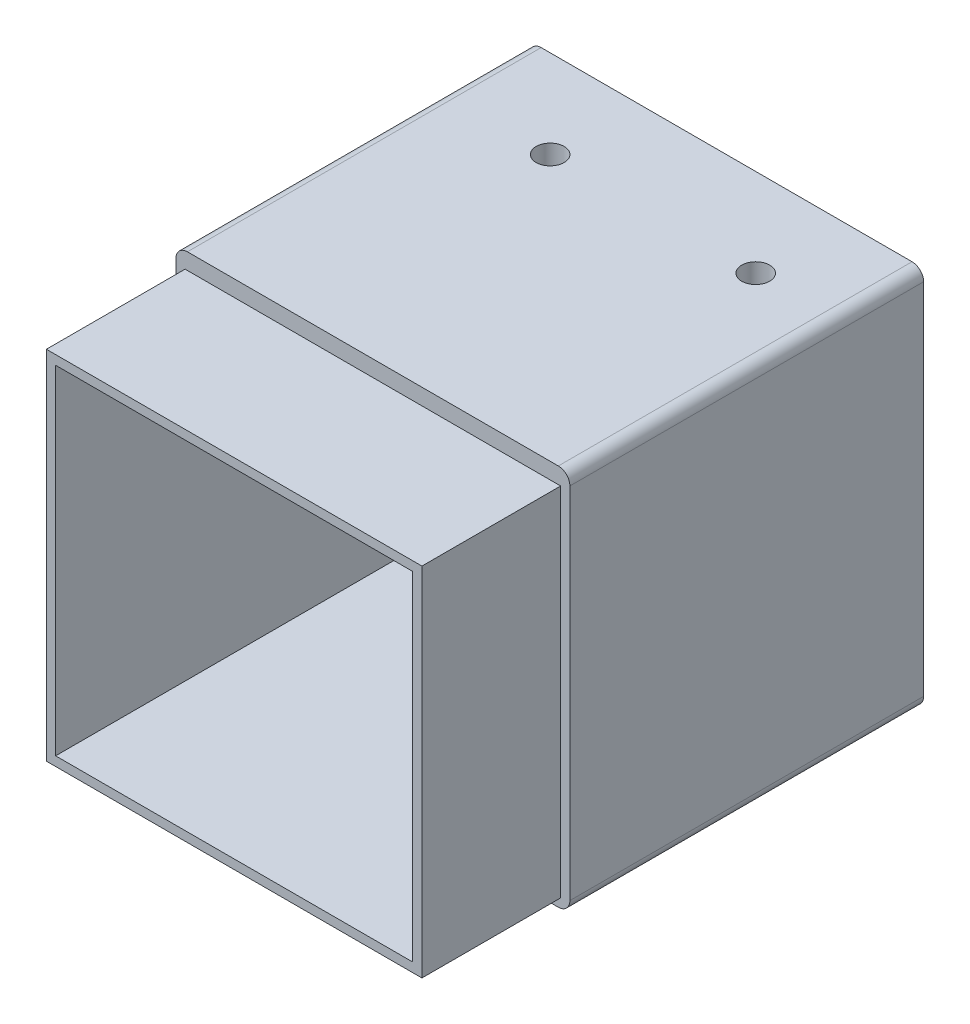
ISO-10303-21;
HEADER;
FILE_DESCRIPTION(('STEP AP214'),'2;1');
FILE_NAME('part.step','',(''),(''),'','','');
FILE_SCHEMA(('AUTOMOTIVE_DESIGN { 1 0 10303 214 1 1 1 1 }'));
ENDSEC;
DATA;
#1=APPLICATION_CONTEXT('core data for automotive mechanical design processes');
#2=APPLICATION_PROTOCOL_DEFINITION('international standard','automotive_design',2000,#1);
#3=PRODUCT_CONTEXT('',#1,'mechanical');
#4=PRODUCT('Part','Part','',(#3));
#5=PRODUCT_RELATED_PRODUCT_CATEGORY('part','',(#4));
#6=PRODUCT_DEFINITION_FORMATION('','',#4);
#7=PRODUCT_DEFINITION_CONTEXT('part definition',#1,'design');
#8=PRODUCT_DEFINITION('design','',#6,#7);
#9=PRODUCT_DEFINITION_SHAPE('','',#8);
#10=(LENGTH_UNIT() NAMED_UNIT(*) SI_UNIT(.MILLI.,.METRE.));
#11=(NAMED_UNIT(*) PLANE_ANGLE_UNIT() SI_UNIT($,.RADIAN.));
#12=(NAMED_UNIT(*) SI_UNIT($,.STERADIAN.) SOLID_ANGLE_UNIT());
#13=UNCERTAINTY_MEASURE_WITH_UNIT(LENGTH_MEASURE(1.E-05),#10,'distance_accuracy_value','');
#14=(GEOMETRIC_REPRESENTATION_CONTEXT(3) GLOBAL_UNCERTAINTY_ASSIGNED_CONTEXT((#13)) GLOBAL_UNIT_ASSIGNED_CONTEXT((#10,
#11,#12)) REPRESENTATION_CONTEXT('',''));
#15=CARTESIAN_POINT('',(0.,0.,0.));
#16=DIRECTION('',(0.,0.,1.));
#17=DIRECTION('',(1.,0.,0.));
#18=AXIS2_PLACEMENT_3D('',#15,#16,#17);
#19=CARTESIAN_POINT('',(-42.608,-40.576,182.776));
#20=DIRECTION('',(0.,1.,0.));
#21=DIRECTION('',(-1.,0.,0.));
#22=AXIS2_PLACEMENT_3D('',#19,#20,#21);
#23=PLANE('',#22);
#24=DIRECTION('',(-1.,0.,0.));
#25=VECTOR('',#24,1.);
#26=CARTESIAN_POINT('',(-42.608,-40.576,80.));
#27=LINE('',#26,#25);
#28=CARTESIAN_POINT('',(40.108,-40.576,80.));
#29=VERTEX_POINT('',#28);
#30=CARTESIAN_POINT('',(-40.108,-40.576,80.));
#31=VERTEX_POINT('',#30);
#32=EDGE_CURVE('E233',#29,#31,#27,.T.);
#33=ORIENTED_EDGE('',*,*,#32,.T.);
#34=DIRECTION('',(0.,0.,-1.));
#35=VECTOR('',#34,1.);
#36=CARTESIAN_POINT('',(-40.108,-40.576,182.776));
#37=LINE('',#36,#35);
#38=CARTESIAN_POINT('',(-40.108,-40.576,3.5));
#39=VERTEX_POINT('',#38);
#40=EDGE_CURVE('E11',#31,#39,#37,.T.);
#41=ORIENTED_EDGE('',*,*,#40,.T.);
#42=DIRECTION('',(-1.,0.,0.));
#43=VECTOR('',#42,1.);
#44=CARTESIAN_POINT('',(42.608,-40.576,3.5));
#45=LINE('',#44,#43);
#46=CARTESIAN_POINT('',(40.108,-40.576,3.5));
#47=VERTEX_POINT('',#46);
#48=EDGE_CURVE('E272',#47,#39,#45,.T.);
#49=ORIENTED_EDGE('',*,*,#48,.F.);
#50=DIRECTION('',(0.,0.,-1.));
#51=VECTOR('',#50,1.);
#52=CARTESIAN_POINT('',(40.108,-40.576,182.776));
#53=LINE('',#52,#51);
#54=EDGE_CURVE('E49',#47,#29,#53,.F.);
#55=ORIENTED_EDGE('',*,*,#54,.T.);
#56=EDGE_LOOP('',(#33,#41,#49,#55));
#57=FACE_BOUND('',#56,.T.);
#58=ADVANCED_FACE('F41',(#57),#23,.F.);
#59=CARTESIAN_POINT('',(42.608,40.576,182.776));
#60=DIRECTION('',(-1.,0.,0.));
#61=DIRECTION('',(0.,-1.,0.));
#62=AXIS2_PLACEMENT_3D('',#59,#60,#61);
#63=PLANE('',#62);
#64=DIRECTION('',(0.,-1.,0.));
#65=VECTOR('',#64,1.);
#66=CARTESIAN_POINT('',(42.608,40.576,3.5));
#67=LINE('',#66,#65);
#68=CARTESIAN_POINT('',(42.608,39.576,3.5));
#69=VERTEX_POINT('',#68);
#70=CARTESIAN_POINT('',(42.608,-38.076,3.5));
#71=VERTEX_POINT('',#70);
#72=EDGE_CURVE('E284',#69,#71,#67,.T.);
#73=ORIENTED_EDGE('',*,*,#72,.F.);
#74=DIRECTION('',(0.,0.,-1.));
#75=VECTOR('',#74,1.);
#76=CARTESIAN_POINT('',(42.608,39.576,80.));
#77=LINE('',#76,#75);
#78=CARTESIAN_POINT('',(42.608,39.576,80.));
#79=VERTEX_POINT('',#78);
#80=EDGE_CURVE('E255',#69,#79,#77,.F.);
#81=ORIENTED_EDGE('',*,*,#80,.T.);
#82=DIRECTION('',(0.,-1.,0.));
#83=VECTOR('',#82,1.);
#84=CARTESIAN_POINT('',(42.608,40.576,80.));
#85=LINE('',#84,#83);
#86=CARTESIAN_POINT('',(42.608,-38.076,80.));
#87=VERTEX_POINT('',#86);
#88=EDGE_CURVE('E227',#79,#87,#85,.T.);
#89=ORIENTED_EDGE('',*,*,#88,.T.);
#90=DIRECTION('',(0.,0.,-1.));
#91=VECTOR('',#90,1.);
#92=CARTESIAN_POINT('',(42.608,-38.076,182.776));
#93=LINE('',#92,#91);
#94=EDGE_CURVE('E252',#87,#71,#93,.T.);
#95=ORIENTED_EDGE('',*,*,#94,.T.);
#96=EDGE_LOOP('',(#73,#81,#89,#95));
#97=FACE_BOUND('',#96,.T.);
#98=ADVANCED_FACE('F283',(#97),#63,.F.);
#99=CARTESIAN_POINT('',(-42.608,40.576,182.776));
#100=DIRECTION('',(1.,0.,0.));
#101=DIRECTION('',(0.,1.,0.));
#102=AXIS2_PLACEMENT_3D('',#99,#100,#101);
#103=PLANE('',#102);
#104=DIRECTION('',(0.,1.,0.));
#105=VECTOR('',#104,1.);
#106=CARTESIAN_POINT('',(-42.608,40.576,80.));
#107=LINE('',#106,#105);
#108=CARTESIAN_POINT('',(-42.608,-38.076,80.));
#109=VERTEX_POINT('',#108);
#110=CARTESIAN_POINT('',(-42.608,39.576,80.));
#111=VERTEX_POINT('',#110);
#112=EDGE_CURVE('E236',#109,#111,#107,.T.);
#113=ORIENTED_EDGE('',*,*,#112,.T.);
#114=DIRECTION('',(0.,0.,1.));
#115=VECTOR('',#114,1.);
#116=CARTESIAN_POINT('',(-42.608,39.576,3.5));
#117=LINE('',#116,#115);
#118=CARTESIAN_POINT('',(-42.608,39.576,3.5));
#119=VERTEX_POINT('',#118);
#120=EDGE_CURVE('E265',#111,#119,#117,.F.);
#121=ORIENTED_EDGE('',*,*,#120,.T.);
#122=DIRECTION('',(0.,1.,0.));
#123=VECTOR('',#122,1.);
#124=CARTESIAN_POINT('',(-42.608,-40.576,3.5));
#125=LINE('',#124,#123);
#126=CARTESIAN_POINT('',(-42.608,-38.076,3.5));
#127=VERTEX_POINT('',#126);
#128=EDGE_CURVE('E291',#127,#119,#125,.T.);
#129=ORIENTED_EDGE('',*,*,#128,.F.);
#130=DIRECTION('',(0.,0.,-1.));
#131=VECTOR('',#130,1.);
#132=CARTESIAN_POINT('',(-42.608,-38.076,182.776));
#133=LINE('',#132,#131);
#134=EDGE_CURVE('E63',#127,#109,#133,.F.);
#135=ORIENTED_EDGE('',*,*,#134,.T.);
#136=EDGE_LOOP('',(#113,#121,#129,#135));
#137=FACE_BOUND('',#136,.T.);
#138=ADVANCED_FACE('F319',(#137),#103,.F.);
#139=CARTESIAN_POINT('',(0.,0.,80.));
#140=DIRECTION('',(0.,0.,-1.));
#141=DIRECTION('',(-1.,0.,0.));
#142=AXIS2_PLACEMENT_3D('',#139,#140,#141);
#143=PLANE('',#142);
#144=ORIENTED_EDGE('',*,*,#88,.F.);
#145=CARTESIAN_POINT('',(40.108,39.576,80.));
#146=DIRECTION('',(0.,0.,-1.));
#147=DIRECTION('',(-1.,0.,0.));
#148=AXIS2_PLACEMENT_3D('',#145,#146,#147);
#149=CIRCLE('',#148,2.5);
#150=CARTESIAN_POINT('',(40.108,42.076,80.));
#151=VERTEX_POINT('',#150);
#152=EDGE_CURVE('E262',#79,#151,#149,.F.);
#153=ORIENTED_EDGE('',*,*,#152,.T.);
#154=DIRECTION('',(1.,0.,0.));
#155=VECTOR('',#154,1.);
#156=CARTESIAN_POINT('',(-42.608,42.076,80.));
#157=LINE('',#156,#155);
#158=CARTESIAN_POINT('',(-40.108,42.076,80.));
#159=VERTEX_POINT('',#158);
#160=EDGE_CURVE('E289',#159,#151,#157,.T.);
#161=ORIENTED_EDGE('',*,*,#160,.F.);
#162=CARTESIAN_POINT('',(-40.108,39.576,80.));
#163=DIRECTION('',(0.,0.,-1.));
#164=DIRECTION('',(-1.,0.,0.));
#165=AXIS2_PLACEMENT_3D('',#162,#163,#164);
#166=CIRCLE('',#165,2.5);
#167=EDGE_CURVE('E56',#159,#111,#166,.F.);
#168=ORIENTED_EDGE('',*,*,#167,.T.);
#169=ORIENTED_EDGE('',*,*,#112,.F.);
#170=CARTESIAN_POINT('',(-40.108,-38.076,80.));
#171=DIRECTION('',(0.,0.,-1.));
#172=DIRECTION('',(-1.,0.,0.));
#173=AXIS2_PLACEMENT_3D('',#170,#171,#172);
#174=CIRCLE('',#173,2.5);
#175=EDGE_CURVE('E259',#109,#31,#174,.F.);
#176=ORIENTED_EDGE('',*,*,#175,.T.);
#177=ORIENTED_EDGE('',*,*,#32,.F.);
#178=CARTESIAN_POINT('',(40.108,-38.076,80.));
#179=DIRECTION('',(0.,0.,-1.));
#180=DIRECTION('',(-1.,0.,0.));
#181=AXIS2_PLACEMENT_3D('',#178,#179,#180);
#182=CIRCLE('',#181,2.5);
#183=EDGE_CURVE('E257',#29,#87,#182,.F.);
#184=ORIENTED_EDGE('',*,*,#183,.T.);
#185=EDGE_LOOP('',(#144,#153,#161,#168,#169,#176,#177,#184));
#186=FACE_BOUND('',#185,.T.);
#187=DIRECTION('',(1.,0.,0.));
#188=VECTOR('',#187,1.);
#189=CARTESIAN_POINT('',(-40.608,-38.576,80.));
#190=LINE('',#189,#188);
#191=CARTESIAN_POINT('',(-40.608,-38.576,80.));
#192=VERTEX_POINT('',#191);
#193=CARTESIAN_POINT('',(40.608,-38.576,80.));
#194=VERTEX_POINT('',#193);
#195=EDGE_CURVE('E192',#192,#194,#190,.T.);
#196=ORIENTED_EDGE('',*,*,#195,.F.);
#197=DIRECTION('',(0.,-1.,0.));
#198=VECTOR('',#197,1.);
#199=CARTESIAN_POINT('',(-40.608,38.576,80.));
#200=LINE('',#199,#198);
#201=CARTESIAN_POINT('',(-40.608,38.576,80.));
#202=VERTEX_POINT('',#201);
#203=EDGE_CURVE('E197',#202,#192,#200,.T.);
#204=ORIENTED_EDGE('',*,*,#203,.F.);
#205=DIRECTION('',(-1.,0.,0.));
#206=VECTOR('',#205,1.);
#207=CARTESIAN_POINT('',(40.608,38.576,80.));
#208=LINE('',#207,#206);
#209=CARTESIAN_POINT('',(40.608,38.576,80.));
#210=VERTEX_POINT('',#209);
#211=EDGE_CURVE('E209',#210,#202,#208,.T.);
#212=ORIENTED_EDGE('',*,*,#211,.F.);
#213=DIRECTION('',(0.,1.,0.));
#214=VECTOR('',#213,1.);
#215=CARTESIAN_POINT('',(40.608,-38.576,80.));
#216=LINE('',#215,#214);
#217=EDGE_CURVE('E206',#194,#210,#216,.T.);
#218=ORIENTED_EDGE('',*,*,#217,.F.);
#219=EDGE_LOOP('',(#196,#204,#212,#218));
#220=FACE_BOUND('',#219,.T.);
#221=ADVANCED_FACE('F276',(#186,#220),#143,.F.);
#222=CARTESIAN_POINT('',(0.,0.,110.));
#223=DIRECTION('',(0.,0.,1.));
#224=DIRECTION('',(1.,0.,0.));
#225=AXIS2_PLACEMENT_3D('',#222,#223,#224);
#226=PLANE('',#225);
#227=DIRECTION('',(1.,0.,0.));
#228=VECTOR('',#227,1.);
#229=CARTESIAN_POINT('',(-40.608,-38.576,110.));
#230=LINE('',#229,#228);
#231=CARTESIAN_POINT('',(-40.608,-38.576,110.));
#232=VERTEX_POINT('',#231);
#233=CARTESIAN_POINT('',(40.608,-38.576,110.));
#234=VERTEX_POINT('',#233);
#235=EDGE_CURVE('E193',#232,#234,#230,.T.);
#236=ORIENTED_EDGE('',*,*,#235,.T.);
#237=DIRECTION('',(0.,1.,0.));
#238=VECTOR('',#237,1.);
#239=CARTESIAN_POINT('',(40.608,-38.576,110.));
#240=LINE('',#239,#238);
#241=CARTESIAN_POINT('',(40.608,38.576,110.));
#242=VERTEX_POINT('',#241);
#243=EDGE_CURVE('E196',#234,#242,#240,.T.);
#244=ORIENTED_EDGE('',*,*,#243,.T.);
#245=DIRECTION('',(-1.,0.,0.));
#246=VECTOR('',#245,1.);
#247=CARTESIAN_POINT('',(40.608,38.576,110.));
#248=LINE('',#247,#246);
#249=CARTESIAN_POINT('',(-40.608,38.576,110.));
#250=VERTEX_POINT('',#249);
#251=EDGE_CURVE('E199',#242,#250,#248,.T.);
#252=ORIENTED_EDGE('',*,*,#251,.T.);
#253=DIRECTION('',(0.,-1.,0.));
#254=VECTOR('',#253,1.);
#255=CARTESIAN_POINT('',(-40.608,38.576,110.));
#256=LINE('',#255,#254);
#257=EDGE_CURVE('E201',#250,#232,#256,.T.);
#258=ORIENTED_EDGE('',*,*,#257,.T.);
#259=EDGE_LOOP('',(#236,#244,#252,#258));
#260=FACE_BOUND('',#259,.T.);
#261=DIRECTION('',(0.,-1.,0.));
#262=VECTOR('',#261,1.);
#263=CARTESIAN_POINT('',(-38.608,36.576,110.));
#264=LINE('',#263,#262);
#265=CARTESIAN_POINT('',(-38.608,36.576,110.));
#266=VERTEX_POINT('',#265);
#267=CARTESIAN_POINT('',(-38.608,-36.576,110.));
#268=VERTEX_POINT('',#267);
#269=EDGE_CURVE('E186',#266,#268,#264,.T.);
#270=ORIENTED_EDGE('',*,*,#269,.F.);
#271=DIRECTION('',(-1.,0.,0.));
#272=VECTOR('',#271,1.);
#273=CARTESIAN_POINT('',(38.608,36.576,110.));
#274=LINE('',#273,#272);
#275=CARTESIAN_POINT('',(38.608,36.576,110.));
#276=VERTEX_POINT('',#275);
#277=EDGE_CURVE('E174',#276,#266,#274,.T.);
#278=ORIENTED_EDGE('',*,*,#277,.F.);
#279=DIRECTION('',(0.,1.,0.));
#280=VECTOR('',#279,1.);
#281=CARTESIAN_POINT('',(38.608,-36.576,110.));
#282=LINE('',#281,#280);
#283=CARTESIAN_POINT('',(38.608,-36.576,110.));
#284=VERTEX_POINT('',#283);
#285=EDGE_CURVE('E190',#284,#276,#282,.T.);
#286=ORIENTED_EDGE('',*,*,#285,.F.);
#287=DIRECTION('',(1.,0.,0.));
#288=VECTOR('',#287,1.);
#289=CARTESIAN_POINT('',(-38.608,-36.576,110.));
#290=LINE('',#289,#288);
#291=EDGE_CURVE('E161',#268,#284,#290,.T.);
#292=ORIENTED_EDGE('',*,*,#291,.F.);
#293=EDGE_LOOP('',(#270,#278,#286,#292));
#294=FACE_BOUND('',#293,.T.);
#295=ADVANCED_FACE('F306',(#260,#294),#226,.T.);
#296=CARTESIAN_POINT('',(-40.608,-38.576,110.));
#297=DIRECTION('',(0.,1.,0.));
#298=DIRECTION('',(-1.,0.,0.));
#299=AXIS2_PLACEMENT_3D('',#296,#297,#298);
#300=PLANE('',#299);
#301=ORIENTED_EDGE('',*,*,#195,.T.);
#302=DIRECTION('',(0.,0.,-1.));
#303=VECTOR('',#302,1.);
#304=CARTESIAN_POINT('',(40.608,-38.576,110.));
#305=LINE('',#304,#303);
#306=EDGE_CURVE('E222',#234,#194,#305,.T.);
#307=ORIENTED_EDGE('',*,*,#306,.F.);
#308=ORIENTED_EDGE('',*,*,#235,.F.);
#309=DIRECTION('',(0.,0.,-1.));
#310=VECTOR('',#309,1.);
#311=CARTESIAN_POINT('',(-40.608,-38.576,110.));
#312=LINE('',#311,#310);
#313=EDGE_CURVE('E203',#232,#192,#312,.T.);
#314=ORIENTED_EDGE('',*,*,#313,.T.);
#315=EDGE_LOOP('',(#301,#307,#308,#314));
#316=FACE_BOUND('',#315,.T.);
#317=ADVANCED_FACE('F308',(#316),#300,.F.);
#318=CARTESIAN_POINT('',(40.608,-38.576,110.));
#319=DIRECTION('',(-1.,0.,0.));
#320=DIRECTION('',(0.,-1.,0.));
#321=AXIS2_PLACEMENT_3D('',#318,#319,#320);
#322=PLANE('',#321);
#323=ORIENTED_EDGE('',*,*,#217,.T.);
#324=DIRECTION('',(0.,0.,-1.));
#325=VECTOR('',#324,1.);
#326=CARTESIAN_POINT('',(40.608,38.576,110.));
#327=LINE('',#326,#325);
#328=EDGE_CURVE('E219',#242,#210,#327,.T.);
#329=ORIENTED_EDGE('',*,*,#328,.F.);
#330=ORIENTED_EDGE('',*,*,#243,.F.);
#331=ORIENTED_EDGE('',*,*,#306,.T.);
#332=EDGE_LOOP('',(#323,#329,#330,#331));
#333=FACE_BOUND('',#332,.T.);
#334=ADVANCED_FACE('F316',(#333),#322,.F.);
#335=CARTESIAN_POINT('',(40.608,38.576,110.));
#336=DIRECTION('',(0.,-1.,0.));
#337=DIRECTION('',(0.,0.,-1.));
#338=AXIS2_PLACEMENT_3D('',#335,#336,#337);
#339=PLANE('',#338);
#340=ORIENTED_EDGE('',*,*,#211,.T.);
#341=DIRECTION('',(0.,0.,-1.));
#342=VECTOR('',#341,1.);
#343=CARTESIAN_POINT('',(-40.608,38.576,110.));
#344=LINE('',#343,#342);
#345=EDGE_CURVE('E216',#250,#202,#344,.T.);
#346=ORIENTED_EDGE('',*,*,#345,.F.);
#347=ORIENTED_EDGE('',*,*,#251,.F.);
#348=ORIENTED_EDGE('',*,*,#328,.T.);
#349=EDGE_LOOP('',(#340,#346,#347,#348));
#350=FACE_BOUND('',#349,.T.);
#351=ADVANCED_FACE('F420',(#350),#339,.F.);
#352=CARTESIAN_POINT('',(-40.608,38.576,110.));
#353=DIRECTION('',(1.,0.,0.));
#354=DIRECTION('',(0.,1.,0.));
#355=AXIS2_PLACEMENT_3D('',#352,#353,#354);
#356=PLANE('',#355);
#357=ORIENTED_EDGE('',*,*,#203,.T.);
#358=ORIENTED_EDGE('',*,*,#313,.F.);
#359=ORIENTED_EDGE('',*,*,#257,.F.);
#360=ORIENTED_EDGE('',*,*,#345,.T.);
#361=EDGE_LOOP('',(#357,#358,#359,#360));
#362=FACE_BOUND('',#361,.T.);
#363=ADVANCED_FACE('F414',(#362),#356,.F.);
#364=CARTESIAN_POINT('',(-42.608,36.576,182.776));
#365=DIRECTION('',(0.,-1.,0.));
#366=DIRECTION('',(0.,0.,-1.));
#367=AXIS2_PLACEMENT_3D('',#364,#365,#366);
#368=PLANE('',#367);
#369=DIRECTION('',(-1.,0.,0.));
#370=VECTOR('',#369,1.);
#371=CARTESIAN_POINT('',(38.608,36.576,8.500000096));
#372=LINE('',#371,#370);
#373=CARTESIAN_POINT('',(38.608,36.576,8.50000009599999));
#374=VERTEX_POINT('',#373);
#375=CARTESIAN_POINT('',(-38.608,36.576,8.50000009599999));
#376=VERTEX_POINT('',#375);
#377=EDGE_CURVE('E180',#374,#376,#372,.T.);
#378=ORIENTED_EDGE('',*,*,#377,.F.);
#379=DIRECTION('',(0.,0.,-1.));
#380=VECTOR('',#379,1.);
#381=CARTESIAN_POINT('',(38.608,36.576,182.776));
#382=LINE('',#381,#380);
#383=EDGE_CURVE('E166',#276,#374,#382,.T.);
#384=ORIENTED_EDGE('',*,*,#383,.F.);
#385=ORIENTED_EDGE('',*,*,#277,.T.);
#386=DIRECTION('',(0.,0.,-1.));
#387=VECTOR('',#386,1.);
#388=CARTESIAN_POINT('',(-38.608,36.576,182.776));
#389=LINE('',#388,#387);
#390=EDGE_CURVE('E224',#266,#376,#389,.T.);
#391=ORIENTED_EDGE('',*,*,#390,.T.);
#392=EDGE_LOOP('',(#378,#384,#385,#391));
#393=FACE_BOUND('',#392,.T.);
#394=ADVANCED_FACE('F300',(#393),#368,.T.);
#395=CARTESIAN_POINT('',(-38.608,40.576,182.776));
#396=DIRECTION('',(1.,0.,0.));
#397=DIRECTION('',(0.,1.,0.));
#398=AXIS2_PLACEMENT_3D('',#395,#396,#397);
#399=PLANE('',#398);
#400=DIRECTION('',(0.,-1.,0.));
#401=VECTOR('',#400,1.);
#402=CARTESIAN_POINT('',(-38.608,36.576,8.500000096));
#403=LINE('',#402,#401);
#404=CARTESIAN_POINT('',(-38.608,-36.576,8.50000009599999));
#405=VERTEX_POINT('',#404);
#406=EDGE_CURVE('E178',#376,#405,#403,.T.);
#407=ORIENTED_EDGE('',*,*,#406,.F.);
#408=ORIENTED_EDGE('',*,*,#390,.F.);
#409=ORIENTED_EDGE('',*,*,#269,.T.);
#410=DIRECTION('',(0.,0.,-1.));
#411=VECTOR('',#410,1.);
#412=CARTESIAN_POINT('',(-38.608,-36.576,182.776));
#413=LINE('',#412,#411);
#414=EDGE_CURVE('E165',#268,#405,#413,.T.);
#415=ORIENTED_EDGE('',*,*,#414,.T.);
#416=EDGE_LOOP('',(#407,#408,#409,#415));
#417=FACE_BOUND('',#416,.T.);
#418=ADVANCED_FACE('F304',(#417),#399,.T.);
#419=CARTESIAN_POINT('',(38.608,40.576,182.776));
#420=DIRECTION('',(-1.,0.,0.));
#421=DIRECTION('',(0.,-1.,0.));
#422=AXIS2_PLACEMENT_3D('',#419,#420,#421);
#423=PLANE('',#422);
#424=DIRECTION('',(0.,1.,0.));
#425=VECTOR('',#424,1.);
#426=CARTESIAN_POINT('',(38.608,-36.576,8.500000096));
#427=LINE('',#426,#425);
#428=CARTESIAN_POINT('',(38.608,-36.576,8.500000096));
#429=VERTEX_POINT('',#428);
#430=EDGE_CURVE('E170',#429,#374,#427,.T.);
#431=ORIENTED_EDGE('',*,*,#430,.F.);
#432=DIRECTION('',(0.,0.,-1.));
#433=VECTOR('',#432,1.);
#434=CARTESIAN_POINT('',(38.608,-36.576,182.776));
#435=LINE('',#434,#433);
#436=EDGE_CURVE('E154',#284,#429,#435,.T.);
#437=ORIENTED_EDGE('',*,*,#436,.F.);
#438=ORIENTED_EDGE('',*,*,#285,.T.);
#439=ORIENTED_EDGE('',*,*,#383,.T.);
#440=EDGE_LOOP('',(#431,#437,#438,#439));
#441=FACE_BOUND('',#440,.T.);
#442=ADVANCED_FACE('F171',(#441),#423,.T.);
#443=CARTESIAN_POINT('',(-42.608,-36.576,182.776));
#444=DIRECTION('',(0.,1.,0.));
#445=DIRECTION('',(-1.,0.,0.));
#446=AXIS2_PLACEMENT_3D('',#443,#444,#445);
#447=PLANE('',#446);
#448=DIRECTION('',(1.,0.,0.));
#449=VECTOR('',#448,1.);
#450=CARTESIAN_POINT('',(-38.608,-36.576,8.500000096));
#451=LINE('',#450,#449);
#452=EDGE_CURVE('E158',#405,#429,#451,.T.);
#453=ORIENTED_EDGE('',*,*,#452,.F.);
#454=ORIENTED_EDGE('',*,*,#414,.F.);
#455=ORIENTED_EDGE('',*,*,#291,.T.);
#456=ORIENTED_EDGE('',*,*,#436,.T.);
#457=EDGE_LOOP('',(#453,#454,#455,#456));
#458=FACE_BOUND('',#457,.T.);
#459=ADVANCED_FACE('F156',(#458),#447,.T.);
#460=CARTESIAN_POINT('',(0.,0.,8.500000096));
#461=DIRECTION('',(0.,0.,1.));
#462=DIRECTION('',(1.,0.,0.));
#463=AXIS2_PLACEMENT_3D('',#460,#461,#462);
#464=PLANE('',#463);
#465=ORIENTED_EDGE('',*,*,#377,.T.);
#466=ORIENTED_EDGE('',*,*,#406,.T.);
#467=ORIENTED_EDGE('',*,*,#452,.T.);
#468=ORIENTED_EDGE('',*,*,#430,.T.);
#469=EDGE_LOOP('',(#465,#466,#467,#468));
#470=FACE_BOUND('',#469,.T.);
#471=ADVANCED_FACE('F177',(#470),#464,.T.);
#472=CARTESIAN_POINT('',(0.,0.,3.5));
#473=DIRECTION('',(0.,0.,-1.));
#474=DIRECTION('',(-1.,0.,0.));
#475=AXIS2_PLACEMENT_3D('',#472,#473,#474);
#476=PLANE('',#475);
#477=DIRECTION('',(-1.,0.,0.));
#478=VECTOR('',#477,1.);
#479=CARTESIAN_POINT('',(42.608,42.076,3.5));
#480=LINE('',#479,#478);
#481=CARTESIAN_POINT('',(40.108,42.076,3.5));
#482=VERTEX_POINT('',#481);
#483=CARTESIAN_POINT('',(-40.108,42.076,3.5));
#484=VERTEX_POINT('',#483);
#485=EDGE_CURVE('E294',#482,#484,#480,.T.);
#486=ORIENTED_EDGE('',*,*,#485,.F.);
#487=CARTESIAN_POINT('',(40.108,39.576,3.5));
#488=DIRECTION('',(0.,0.,-1.));
#489=DIRECTION('',(-1.,0.,0.));
#490=AXIS2_PLACEMENT_3D('',#487,#488,#489);
#491=CIRCLE('',#490,2.5);
#492=EDGE_CURVE('E250',#482,#69,#491,.T.);
#493=ORIENTED_EDGE('',*,*,#492,.T.);
#494=ORIENTED_EDGE('',*,*,#72,.T.);
#495=CARTESIAN_POINT('',(40.108,-38.076,3.5));
#496=DIRECTION('',(0.,0.,-1.));
#497=DIRECTION('',(-1.,0.,0.));
#498=AXIS2_PLACEMENT_3D('',#495,#496,#497);
#499=CIRCLE('',#498,2.5);
#500=EDGE_CURVE('E244',#71,#47,#499,.T.);
#501=ORIENTED_EDGE('',*,*,#500,.T.);
#502=ORIENTED_EDGE('',*,*,#48,.T.);
#503=CARTESIAN_POINT('',(-40.108,-38.076,3.5));
#504=DIRECTION('',(0.,0.,-1.));
#505=DIRECTION('',(-1.,0.,0.));
#506=AXIS2_PLACEMENT_3D('',#503,#504,#505);
#507=CIRCLE('',#506,2.5);
#508=EDGE_CURVE('E246',#39,#127,#507,.T.);
#509=ORIENTED_EDGE('',*,*,#508,.T.);
#510=ORIENTED_EDGE('',*,*,#128,.T.);
#511=CARTESIAN_POINT('',(-40.108,39.576,3.5));
#512=DIRECTION('',(0.,0.,-1.));
#513=DIRECTION('',(-1.,0.,0.));
#514=AXIS2_PLACEMENT_3D('',#511,#512,#513);
#515=CIRCLE('',#514,2.5);
#516=EDGE_CURVE('E248',#119,#484,#515,.T.);
#517=ORIENTED_EDGE('',*,*,#516,.T.);
#518=EDGE_LOOP('',(#486,#493,#494,#501,#502,#509,#510,#517));
#519=FACE_BOUND('',#518,.T.);
#520=ADVANCED_FACE('F288',(#519),#476,.T.);
#521=CARTESIAN_POINT('',(0.,42.076,0.));
#522=DIRECTION('',(0.,1.,0.));
#523=DIRECTION('',(0.,0.,1.));
#524=AXIS2_PLACEMENT_3D('',#521,#522,#523);
#525=PLANE('',#524);
#526=CARTESIAN_POINT('',(-19.1105255968429,42.076,22.5499523809517));
#527=DIRECTION('',(0.,1.,0.));
#528=DIRECTION('',(0.,0.,1.));
#529=AXIS2_PLACEMENT_3D('',#526,#527,#528);
#530=CIRCLE('',#529,3.025);
#531=CARTESIAN_POINT('',(-19.1105255968429,42.076,25.5749523809517));
#532=VERTEX_POINT('',#531);
#533=EDGE_CURVE('E357',#532,#532,#530,.T.);
#534=ORIENTED_EDGE('',*,*,#533,.F.);
#535=EDGE_LOOP('',(#534));
#536=FACE_BOUND('',#535,.T.);
#537=CARTESIAN_POINT('',(25.3394744031571,42.076,22.5499523809517));
#538=DIRECTION('',(0.,1.,0.));
#539=DIRECTION('',(0.,0.,1.));
#540=AXIS2_PLACEMENT_3D('',#537,#538,#539);
#541=CIRCLE('',#540,3.025);
#542=CARTESIAN_POINT('',(25.3394744031571,42.076,25.5749523809517));
#543=VERTEX_POINT('',#542);
#544=EDGE_CURVE('E365',#543,#543,#541,.T.);
#545=ORIENTED_EDGE('',*,*,#544,.F.);
#546=EDGE_LOOP('',(#545));
#547=FACE_BOUND('',#546,.T.);
#548=ORIENTED_EDGE('',*,*,#160,.T.);
#549=DIRECTION('',(0.,0.,-1.));
#550=VECTOR('',#549,1.);
#551=CARTESIAN_POINT('',(40.108,42.076,3.5));
#552=LINE('',#551,#550);
#553=EDGE_CURVE('E241',#151,#482,#552,.T.);
#554=ORIENTED_EDGE('',*,*,#553,.T.);
#555=ORIENTED_EDGE('',*,*,#485,.T.);
#556=DIRECTION('',(0.,0.,1.));
#557=VECTOR('',#556,1.);
#558=CARTESIAN_POINT('',(-40.108,42.076,80.));
#559=LINE('',#558,#557);
#560=EDGE_CURVE('E238',#484,#159,#559,.T.);
#561=ORIENTED_EDGE('',*,*,#560,.T.);
#562=EDGE_LOOP('',(#548,#554,#555,#561));
#563=FACE_BOUND('',#562,.T.);
#564=ADVANCED_FACE('F339',(#536,#547,#563),#525,.T.);
#565=CARTESIAN_POINT('',(40.108,39.576,0.));
#566=DIRECTION('',(0.,0.,1.));
#567=DIRECTION('',(1.,0.,0.));
#568=AXIS2_PLACEMENT_3D('',#565,#566,#567);
#569=CYLINDRICAL_SURFACE('',#568,2.5);
#570=ORIENTED_EDGE('',*,*,#152,.F.);
#571=ORIENTED_EDGE('',*,*,#80,.F.);
#572=ORIENTED_EDGE('',*,*,#492,.F.);
#573=ORIENTED_EDGE('',*,*,#553,.F.);
#574=EDGE_LOOP('',(#570,#571,#572,#573));
#575=FACE_BOUND('',#574,.T.);
#576=ADVANCED_FACE('F335',(#575),#569,.T.);
#577=CARTESIAN_POINT('',(-40.108,39.576,0.));
#578=DIRECTION('',(0.,0.,-1.));
#579=DIRECTION('',(-1.,0.,0.));
#580=AXIS2_PLACEMENT_3D('',#577,#578,#579);
#581=CYLINDRICAL_SURFACE('',#580,2.5);
#582=ORIENTED_EDGE('',*,*,#516,.F.);
#583=ORIENTED_EDGE('',*,*,#120,.F.);
#584=ORIENTED_EDGE('',*,*,#167,.F.);
#585=ORIENTED_EDGE('',*,*,#560,.F.);
#586=EDGE_LOOP('',(#582,#583,#584,#585));
#587=FACE_BOUND('',#586,.T.);
#588=ADVANCED_FACE('F338',(#587),#581,.T.);
#589=CARTESIAN_POINT('',(-40.108,-38.076,182.776));
#590=DIRECTION('',(0.,0.,-1.));
#591=DIRECTION('',(-1.,0.,0.));
#592=AXIS2_PLACEMENT_3D('',#589,#590,#591);
#593=CYLINDRICAL_SURFACE('',#592,2.5);
#594=ORIENTED_EDGE('',*,*,#175,.F.);
#595=ORIENTED_EDGE('',*,*,#134,.F.);
#596=ORIENTED_EDGE('',*,*,#508,.F.);
#597=ORIENTED_EDGE('',*,*,#40,.F.);
#598=EDGE_LOOP('',(#594,#595,#596,#597));
#599=FACE_BOUND('',#598,.T.);
#600=ADVANCED_FACE('F342',(#599),#593,.T.);
#601=CARTESIAN_POINT('',(40.108,-38.076,182.776));
#602=DIRECTION('',(0.,0.,-1.));
#603=DIRECTION('',(-1.,0.,0.));
#604=AXIS2_PLACEMENT_3D('',#601,#602,#603);
#605=CYLINDRICAL_SURFACE('',#604,2.5);
#606=ORIENTED_EDGE('',*,*,#183,.F.);
#607=ORIENTED_EDGE('',*,*,#54,.F.);
#608=ORIENTED_EDGE('',*,*,#500,.F.);
#609=ORIENTED_EDGE('',*,*,#94,.F.);
#610=EDGE_LOOP('',(#606,#607,#608,#609));
#611=FACE_BOUND('',#610,.T.);
#612=ADVANCED_FACE('F43',(#611),#605,.T.);
#613=CARTESIAN_POINT('',(25.3394744031571,37.076,22.5499523809517));
#614=DIRECTION('',(0.,1.,0.));
#615=DIRECTION('',(0.,0.,1.));
#616=AXIS2_PLACEMENT_3D('',#613,#614,#615);
#617=CYLINDRICAL_SURFACE('',#616,3.025);
#618=CARTESIAN_POINT('',(25.3394744031571,37.076,22.5499523809517));
#619=DIRECTION('',(0.,1.,0.));
#620=DIRECTION('',(0.,0.,1.));
#621=AXIS2_PLACEMENT_3D('',#618,#619,#620);
#622=CIRCLE('',#621,3.025);
#623=CARTESIAN_POINT('',(25.3394744031571,37.076,25.5749523809517));
#624=VERTEX_POINT('',#623);
#625=EDGE_CURVE('E362',#624,#624,#622,.T.);
#626=ORIENTED_EDGE('',*,*,#625,.F.);
#627=EDGE_LOOP('',(#626));
#628=FACE_BOUND('',#627,.T.);
#629=ORIENTED_EDGE('',*,*,#544,.T.);
#630=EDGE_LOOP('',(#629));
#631=FACE_BOUND('',#630,.T.);
#632=ADVANCED_FACE('F350',(#628,#631),#617,.F.);
#633=CARTESIAN_POINT('',(25.3394744031571,37.076,22.5499523809517));
#634=DIRECTION('',(0.,1.,0.));
#635=DIRECTION('',(0.,0.,1.));
#636=AXIS2_PLACEMENT_3D('',#633,#634,#635);
#637=PLANE('',#636);
#638=ORIENTED_EDGE('',*,*,#625,.T.);
#639=EDGE_LOOP('',(#638));
#640=FACE_BOUND('',#639,.T.);
#641=ADVANCED_FACE('F376',(#640),#637,.T.);
#642=CARTESIAN_POINT('',(-19.1105255968429,37.076,22.5499523809517));
#643=DIRECTION('',(0.,1.,0.));
#644=DIRECTION('',(0.,0.,1.));
#645=AXIS2_PLACEMENT_3D('',#642,#643,#644);
#646=CYLINDRICAL_SURFACE('',#645,3.025);
#647=CARTESIAN_POINT('',(-19.1105255968429,37.076,22.5499523809517));
#648=DIRECTION('',(0.,1.,0.));
#649=DIRECTION('',(0.,0.,1.));
#650=AXIS2_PLACEMENT_3D('',#647,#648,#649);
#651=CIRCLE('',#650,3.025);
#652=CARTESIAN_POINT('',(-19.1105255968429,37.076,25.5749523809517));
#653=VERTEX_POINT('',#652);
#654=EDGE_CURVE('E359',#653,#653,#651,.T.);
#655=ORIENTED_EDGE('',*,*,#654,.F.);
#656=EDGE_LOOP('',(#655));
#657=FACE_BOUND('',#656,.T.);
#658=ORIENTED_EDGE('',*,*,#533,.T.);
#659=EDGE_LOOP('',(#658));
#660=FACE_BOUND('',#659,.T.);
#661=ADVANCED_FACE('F373',(#657,#660),#646,.F.);
#662=CARTESIAN_POINT('',(-19.1105255968429,37.076,22.5499523809517));
#663=DIRECTION('',(0.,1.,0.));
#664=DIRECTION('',(0.,0.,1.));
#665=AXIS2_PLACEMENT_3D('',#662,#663,#664);
#666=PLANE('',#665);
#667=ORIENTED_EDGE('',*,*,#654,.T.);
#668=EDGE_LOOP('',(#667));
#669=FACE_BOUND('',#668,.T.);
#670=ADVANCED_FACE('F371',(#669),#666,.T.);
#671=CLOSED_SHELL('',(#58,#98,#138,#221,#295,#317,#334,#351,#363,#394,#418,#442,#459,#471,#520,
#564,#576,#588,#600,#612,#632,#641,#661,#670));
#672=MANIFOLD_SOLID_BREP('B2',#671);
#673=ADVANCED_BREP_SHAPE_REPRESENTATION('',(#18,#672),#14);
#674=SHAPE_DEFINITION_REPRESENTATION(#9,#673);
ENDSEC;
END-ISO-10303-21;
